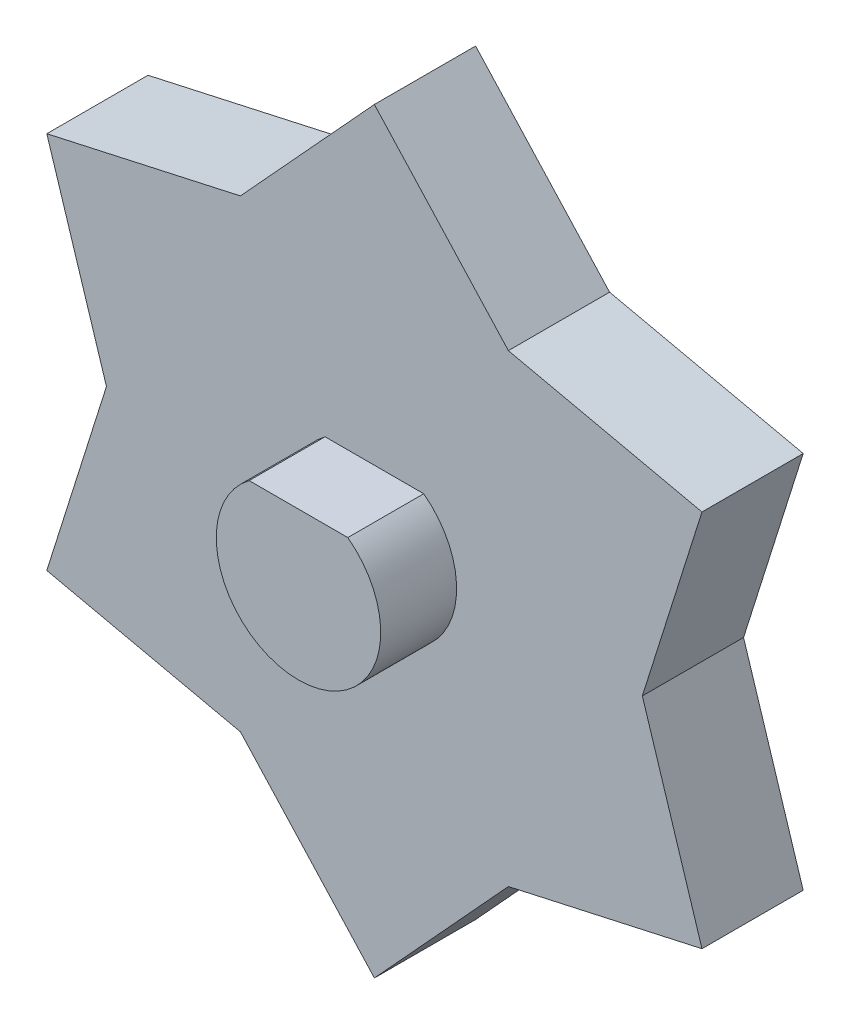
ISO-10303-21;
HEADER;
FILE_DESCRIPTION(('STEP AP214'),'2;1');
FILE_NAME('part.step','',(''),(''),'','','');
FILE_SCHEMA(('AUTOMOTIVE_DESIGN { 1 0 10303 214 1 1 1 1 }'));
ENDSEC;
DATA;
#1=APPLICATION_CONTEXT('core data for automotive mechanical design processes');
#2=APPLICATION_PROTOCOL_DEFINITION('international standard','automotive_design',2000,#1);
#3=PRODUCT_CONTEXT('',#1,'mechanical');
#4=PRODUCT('Part','Part','',(#3));
#5=PRODUCT_RELATED_PRODUCT_CATEGORY('part','',(#4));
#6=PRODUCT_DEFINITION_FORMATION('','',#4);
#7=PRODUCT_DEFINITION_CONTEXT('part definition',#1,'design');
#8=PRODUCT_DEFINITION('design','',#6,#7);
#9=PRODUCT_DEFINITION_SHAPE('','',#8);
#10=(LENGTH_UNIT() NAMED_UNIT(*) SI_UNIT(.MILLI.,.METRE.));
#11=(NAMED_UNIT(*) PLANE_ANGLE_UNIT() SI_UNIT($,.RADIAN.));
#12=(NAMED_UNIT(*) SI_UNIT($,.STERADIAN.) SOLID_ANGLE_UNIT());
#13=UNCERTAINTY_MEASURE_WITH_UNIT(LENGTH_MEASURE(1.E-05),#10,'distance_accuracy_value','');
#14=(GEOMETRIC_REPRESENTATION_CONTEXT(3) GLOBAL_UNCERTAINTY_ASSIGNED_CONTEXT((#13)) GLOBAL_UNIT_ASSIGNED_CONTEXT((#10,
#11,#12)) REPRESENTATION_CONTEXT('',''));
#15=CARTESIAN_POINT('',(0.,0.,0.));
#16=DIRECTION('',(0.,0.,1.));
#17=DIRECTION('',(1.,0.,0.));
#18=AXIS2_PLACEMENT_3D('',#15,#16,#17);
#19=CARTESIAN_POINT('',(0.,0.,0.));
#20=DIRECTION('',(0.,0.,1.));
#21=DIRECTION('',(1.,0.,0.));
#22=AXIS2_PLACEMENT_3D('',#19,#20,#21);
#23=PLANE('',#22);
#24=DIRECTION('',(0.300705799504278,-0.953716950748225,0.));
#25=VECTOR('',#24,1.);
#26=CARTESIAN_POINT('',(4.81627060127854,1.51856428749661,0.));
#27=LINE('',#26,#25);
#28=CARTESIAN_POINT('',(5.29507208196112,0.,0.));
#29=VERTEX_POINT('',#28);
#30=CARTESIAN_POINT('',(6.4734927176438,-3.73747276312873,0.));
#31=VERTEX_POINT('',#30);
#32=EDGE_CURVE('E214',#29,#31,#27,.T.);
#33=ORIENTED_EDGE('',*,*,#32,.F.);
#34=DIRECTION('',(-0.300705799504272,-0.953716950748227,0.));
#35=VECTOR('',#34,1.);
#36=CARTESIAN_POINT('',(4.81627060127858,-1.51856428749658,0.));
#37=LINE('',#36,#35);
#38=CARTESIAN_POINT('',(6.4734927176438,3.73747276312873,0.));
#39=VERTEX_POINT('',#38);
#40=EDGE_CURVE('E217',#39,#29,#37,.T.);
#41=ORIENTED_EDGE('',*,*,#40,.F.);
#42=DIRECTION('',(0.976296007119935,-0.216439613938098,0.));
#43=VECTOR('',#42,1.);
#44=CARTESIAN_POINT('',(1.09302005038739,4.93029483595567,0.));
#45=LINE('',#44,#43);
#46=CARTESIAN_POINT('',(2.6475360409806,4.58566693784806,0.));
#47=VERTEX_POINT('',#46);
#48=EDGE_CURVE('E220',#47,#39,#45,.T.);
#49=ORIENTED_EDGE('',*,*,#48,.F.);
#50=DIRECTION('',(0.675590207615661,-0.737277336810123,0.));
#51=VECTOR('',#50,1.);
#52=CARTESIAN_POINT('',(3.72325055089115,3.41173054845911,0.));
#53=LINE('',#52,#51);
#54=CARTESIAN_POINT('',(0.,7.47494552625746,0.));
#55=VERTEX_POINT('',#54);
#56=EDGE_CURVE('E222',#55,#47,#53,.T.);
#57=ORIENTED_EDGE('',*,*,#56,.F.);
#58=DIRECTION('',(0.675590207615657,0.737277336810128,0.));
#59=VECTOR('',#58,1.);
#60=CARTESIAN_POINT('',(-3.72325055089115,3.41173054845907,0.));
#61=LINE('',#60,#59);
#62=CARTESIAN_POINT('',(-2.64753604098053,4.5856669378481,0.));
#63=VERTEX_POINT('',#62);
#64=EDGE_CURVE('E224',#63,#55,#61,.T.);
#65=ORIENTED_EDGE('',*,*,#64,.F.);
#66=DIRECTION('',(0.976296007119933,0.216439613938105,0.));
#67=VECTOR('',#66,1.);
#68=CARTESIAN_POINT('',(-1.09302005038744,4.9302948359557,0.));
#69=LINE('',#68,#67);
#70=CARTESIAN_POINT('',(-6.4734927176438,3.73747276312873,0.));
#71=VERTEX_POINT('',#70);
#72=EDGE_CURVE('E226',#71,#63,#69,.T.);
#73=ORIENTED_EDGE('',*,*,#72,.F.);
#74=DIRECTION('',(-0.300705799504278,0.953716950748225,0.));
#75=VECTOR('',#74,1.);
#76=CARTESIAN_POINT('',(-4.81627060127854,-1.51856428749661,0.));
#77=LINE('',#76,#75);
#78=CARTESIAN_POINT('',(-5.29507208196112,0.,0.));
#79=VERTEX_POINT('',#78);
#80=EDGE_CURVE('E228',#79,#71,#77,.T.);
#81=ORIENTED_EDGE('',*,*,#80,.F.);
#82=DIRECTION('',(0.300705799504271,0.953716950748228,0.));
#83=VECTOR('',#82,1.);
#84=CARTESIAN_POINT('',(-4.81627060127859,1.51856428749658,0.));
#85=LINE('',#84,#83);
#86=CARTESIAN_POINT('',(-6.4734927176438,-3.73747276312873,0.));
#87=VERTEX_POINT('',#86);
#88=EDGE_CURVE('E230',#87,#79,#85,.T.);
#89=ORIENTED_EDGE('',*,*,#88,.F.);
#90=DIRECTION('',(-0.976296007119935,0.216439613938097,0.));
#91=VECTOR('',#90,1.);
#92=CARTESIAN_POINT('',(-1.09302005038739,-4.93029483595567,0.));
#93=LINE('',#92,#91);
#94=CARTESIAN_POINT('',(-2.6475360409806,-4.58566693784807,0.));
#95=VERTEX_POINT('',#94);
#96=EDGE_CURVE('E232',#95,#87,#93,.T.);
#97=ORIENTED_EDGE('',*,*,#96,.F.);
#98=DIRECTION('',(-0.675590207615661,0.737277336810123,0.));
#99=VECTOR('',#98,1.);
#100=CARTESIAN_POINT('',(-3.72325055089115,-3.41173054845912,0.));
#101=LINE('',#100,#99);
#102=CARTESIAN_POINT('',(0.,-7.47494552625746,0.));
#103=VERTEX_POINT('',#102);
#104=EDGE_CURVE('E234',#103,#95,#101,.T.);
#105=ORIENTED_EDGE('',*,*,#104,.F.);
#106=DIRECTION('',(-0.675590207615656,-0.737277336810128,0.));
#107=VECTOR('',#106,1.);
#108=CARTESIAN_POINT('',(3.72325055089115,-3.41173054845907,0.));
#109=LINE('',#108,#107);
#110=CARTESIAN_POINT('',(2.64753604098052,-4.58566693784811,0.));
#111=VERTEX_POINT('',#110);
#112=EDGE_CURVE('E197',#111,#103,#109,.T.);
#113=ORIENTED_EDGE('',*,*,#112,.F.);
#114=DIRECTION('',(-0.976296007119933,-0.216439613938104,0.));
#115=VECTOR('',#114,1.);
#116=CARTESIAN_POINT('',(1.09302005038744,-4.9302948359557,0.));
#117=LINE('',#116,#115);
#118=EDGE_CURVE('E150',#31,#111,#117,.T.);
#119=ORIENTED_EDGE('',*,*,#118,.F.);
#120=EDGE_LOOP('',(#33,#41,#49,#57,#65,#73,#81,#89,#97,#105,#113,#119));
#121=FACE_BOUND('',#120,.T.);
#122=CARTESIAN_POINT('',(0.,0.,0.));
#123=DIRECTION('',(0.,0.,1.));
#124=DIRECTION('',(1.,0.,0.));
#125=AXIS2_PLACEMENT_3D('',#122,#123,#124);
#126=CIRCLE('',#125,1.625);
#127=CARTESIAN_POINT('',(-0.975,1.3,0.));
#128=VERTEX_POINT('',#127);
#129=CARTESIAN_POINT('',(0.975,1.3,0.));
#130=VERTEX_POINT('',#129);
#131=EDGE_CURVE('E92',#128,#130,#126,.T.);
#132=ORIENTED_EDGE('',*,*,#131,.F.);
#133=DIRECTION('',(1.,0.,0.));
#134=VECTOR('',#133,1.);
#135=CARTESIAN_POINT('',(0.,1.3,0.));
#136=LINE('',#135,#134);
#137=EDGE_CURVE('E12',#128,#130,#136,.T.);
#138=ORIENTED_EDGE('',*,*,#137,.T.);
#139=EDGE_LOOP('',(#132,#138));
#140=FACE_BOUND('',#139,.T.);
#141=ADVANCED_FACE('F84',(#121,#140),#23,.T.);
#142=CARTESIAN_POINT('',(4.81627060127854,1.51856428749661,-2.));
#143=DIRECTION('',(-0.953716950748225,-0.300705799504278,0.));
#144=DIRECTION('',(0.300705799504278,-0.953716950748225,0.));
#145=AXIS2_PLACEMENT_3D('',#142,#143,#144);
#146=PLANE('',#145);
#147=ORIENTED_EDGE('',*,*,#32,.T.);
#148=DIRECTION('',(0.,0.,1.));
#149=VECTOR('',#148,1.);
#150=CARTESIAN_POINT('',(6.4734927176438,-3.73747276312873,-2.));
#151=LINE('',#150,#149);
#152=CARTESIAN_POINT('',(6.4734927176438,-3.73747276312873,-2.));
#153=VERTEX_POINT('',#152);
#154=EDGE_CURVE('E239',#153,#31,#151,.T.);
#155=ORIENTED_EDGE('',*,*,#154,.F.);
#156=DIRECTION('',(0.300705799504278,-0.953716950748225,0.));
#157=VECTOR('',#156,1.);
#158=CARTESIAN_POINT('',(4.81627060127854,1.51856428749661,-2.));
#159=LINE('',#158,#157);
#160=CARTESIAN_POINT('',(5.29507208196112,0.,-2.));
#161=VERTEX_POINT('',#160);
#162=EDGE_CURVE('E238',#161,#153,#159,.T.);
#163=ORIENTED_EDGE('',*,*,#162,.F.);
#164=DIRECTION('',(0.,0.,1.));
#165=VECTOR('',#164,1.);
#166=CARTESIAN_POINT('',(5.29507208196112,0.,-2.));
#167=LINE('',#166,#165);
#168=EDGE_CURVE('E213',#161,#29,#167,.T.);
#169=ORIENTED_EDGE('',*,*,#168,.T.);
#170=EDGE_LOOP('',(#147,#155,#163,#169));
#171=FACE_BOUND('',#170,.T.);
#172=ADVANCED_FACE('F86',(#171),#146,.F.);
#173=CARTESIAN_POINT('',(1.09302005038744,-4.9302948359557,-2.));
#174=DIRECTION('',(-0.216439613938104,0.976296007119933,0.));
#175=DIRECTION('',(-0.976296007119933,-0.216439613938104,0.));
#176=AXIS2_PLACEMENT_3D('',#173,#174,#175);
#177=PLANE('',#176);
#178=ORIENTED_EDGE('',*,*,#118,.T.);
#179=DIRECTION('',(0.,0.,1.));
#180=VECTOR('',#179,1.);
#181=CARTESIAN_POINT('',(2.64753604098052,-4.58566693784811,-2.));
#182=LINE('',#181,#180);
#183=CARTESIAN_POINT('',(2.64753604098052,-4.58566693784811,-2.));
#184=VERTEX_POINT('',#183);
#185=EDGE_CURVE('E200',#184,#111,#182,.T.);
#186=ORIENTED_EDGE('',*,*,#185,.F.);
#187=DIRECTION('',(-0.976296007119933,-0.216439613938104,0.));
#188=VECTOR('',#187,1.);
#189=CARTESIAN_POINT('',(1.09302005038744,-4.9302948359557,-2.));
#190=LINE('',#189,#188);
#191=EDGE_CURVE('E105',#153,#184,#190,.T.);
#192=ORIENTED_EDGE('',*,*,#191,.F.);
#193=ORIENTED_EDGE('',*,*,#154,.T.);
#194=EDGE_LOOP('',(#178,#186,#192,#193));
#195=FACE_BOUND('',#194,.T.);
#196=ADVANCED_FACE('F334',(#195),#177,.F.);
#197=CARTESIAN_POINT('',(3.72325055089115,-3.41173054845907,-2.));
#198=DIRECTION('',(-0.737277336810128,0.675590207615656,0.));
#199=DIRECTION('',(-0.675590207615656,-0.737277336810128,0.));
#200=AXIS2_PLACEMENT_3D('',#197,#198,#199);
#201=PLANE('',#200);
#202=ORIENTED_EDGE('',*,*,#112,.T.);
#203=DIRECTION('',(0.,0.,1.));
#204=VECTOR('',#203,1.);
#205=CARTESIAN_POINT('',(0.,-7.47494552625746,-2.));
#206=LINE('',#205,#204);
#207=CARTESIAN_POINT('',(0.,-7.47494552625746,-2.));
#208=VERTEX_POINT('',#207);
#209=EDGE_CURVE('E195',#208,#103,#206,.T.);
#210=ORIENTED_EDGE('',*,*,#209,.F.);
#211=DIRECTION('',(-0.675590207615656,-0.737277336810128,0.));
#212=VECTOR('',#211,1.);
#213=CARTESIAN_POINT('',(3.72325055089115,-3.41173054845907,-2.));
#214=LINE('',#213,#212);
#215=EDGE_CURVE('E185',#184,#208,#214,.T.);
#216=ORIENTED_EDGE('',*,*,#215,.F.);
#217=ORIENTED_EDGE('',*,*,#185,.T.);
#218=EDGE_LOOP('',(#202,#210,#216,#217));
#219=FACE_BOUND('',#218,.T.);
#220=ADVANCED_FACE('F196',(#219),#201,.F.);
#221=CARTESIAN_POINT('',(-3.72325055089115,-3.41173054845912,-2.));
#222=DIRECTION('',(0.737277336810123,0.675590207615661,0.));
#223=DIRECTION('',(-0.675590207615661,0.737277336810123,0.));
#224=AXIS2_PLACEMENT_3D('',#221,#222,#223);
#225=PLANE('',#224);
#226=ORIENTED_EDGE('',*,*,#104,.T.);
#227=DIRECTION('',(0.,0.,1.));
#228=VECTOR('',#227,1.);
#229=CARTESIAN_POINT('',(-2.6475360409806,-4.58566693784807,-2.));
#230=LINE('',#229,#228);
#231=CARTESIAN_POINT('',(-2.6475360409806,-4.58566693784807,-2.));
#232=VERTEX_POINT('',#231);
#233=EDGE_CURVE('E201',#232,#95,#230,.T.);
#234=ORIENTED_EDGE('',*,*,#233,.F.);
#235=DIRECTION('',(-0.675590207615661,0.737277336810123,0.));
#236=VECTOR('',#235,1.);
#237=CARTESIAN_POINT('',(-3.72325055089115,-3.41173054845912,-2.));
#238=LINE('',#237,#236);
#239=EDGE_CURVE('E189',#208,#232,#238,.T.);
#240=ORIENTED_EDGE('',*,*,#239,.F.);
#241=ORIENTED_EDGE('',*,*,#209,.T.);
#242=EDGE_LOOP('',(#226,#234,#240,#241));
#243=FACE_BOUND('',#242,.T.);
#244=ADVANCED_FACE('F203',(#243),#225,.F.);
#245=CARTESIAN_POINT('',(-1.09302005038739,-4.93029483595567,-2.));
#246=DIRECTION('',(0.216439613938097,0.976296007119935,0.));
#247=DIRECTION('',(-0.976296007119935,0.216439613938097,0.));
#248=AXIS2_PLACEMENT_3D('',#245,#246,#247);
#249=PLANE('',#248);
#250=ORIENTED_EDGE('',*,*,#96,.T.);
#251=DIRECTION('',(0.,0.,1.));
#252=VECTOR('',#251,1.);
#253=CARTESIAN_POINT('',(-6.4734927176438,-3.73747276312873,-2.));
#254=LINE('',#253,#252);
#255=CARTESIAN_POINT('',(-6.4734927176438,-3.73747276312873,-2.));
#256=VERTEX_POINT('',#255);
#257=EDGE_CURVE('E243',#256,#87,#254,.T.);
#258=ORIENTED_EDGE('',*,*,#257,.F.);
#259=DIRECTION('',(-0.976296007119935,0.216439613938097,0.));
#260=VECTOR('',#259,1.);
#261=CARTESIAN_POINT('',(-1.09302005038739,-4.93029483595567,-2.));
#262=LINE('',#261,#260);
#263=EDGE_CURVE('E206',#232,#256,#262,.T.);
#264=ORIENTED_EDGE('',*,*,#263,.F.);
#265=ORIENTED_EDGE('',*,*,#233,.T.);
#266=EDGE_LOOP('',(#250,#258,#264,#265));
#267=FACE_BOUND('',#266,.T.);
#268=ADVANCED_FACE('F337',(#267),#249,.F.);
#269=CARTESIAN_POINT('',(-4.81627060127859,1.51856428749658,-2.));
#270=DIRECTION('',(0.953716950748227,-0.300705799504271,0.));
#271=DIRECTION('',(0.300705799504271,0.953716950748228,0.));
#272=AXIS2_PLACEMENT_3D('',#269,#270,#271);
#273=PLANE('',#272);
#274=ORIENTED_EDGE('',*,*,#88,.T.);
#275=DIRECTION('',(0.,0.,1.));
#276=VECTOR('',#275,1.);
#277=CARTESIAN_POINT('',(-5.29507208196112,0.,-2.));
#278=LINE('',#277,#276);
#279=CARTESIAN_POINT('',(-5.29507208196112,0.,-2.));
#280=VERTEX_POINT('',#279);
#281=EDGE_CURVE('E246',#280,#79,#278,.T.);
#282=ORIENTED_EDGE('',*,*,#281,.F.);
#283=DIRECTION('',(0.300705799504271,0.953716950748228,0.));
#284=VECTOR('',#283,1.);
#285=CARTESIAN_POINT('',(-4.81627060127859,1.51856428749658,-2.));
#286=LINE('',#285,#284);
#287=EDGE_CURVE('E208',#256,#280,#286,.T.);
#288=ORIENTED_EDGE('',*,*,#287,.F.);
#289=ORIENTED_EDGE('',*,*,#257,.T.);
#290=EDGE_LOOP('',(#274,#282,#288,#289));
#291=FACE_BOUND('',#290,.T.);
#292=ADVANCED_FACE('F303',(#291),#273,.F.);
#293=CARTESIAN_POINT('',(-4.81627060127854,-1.51856428749661,-2.));
#294=DIRECTION('',(0.953716950748225,0.300705799504278,0.));
#295=DIRECTION('',(-0.300705799504278,0.953716950748225,0.));
#296=AXIS2_PLACEMENT_3D('',#293,#294,#295);
#297=PLANE('',#296);
#298=ORIENTED_EDGE('',*,*,#80,.T.);
#299=DIRECTION('',(0.,0.,1.));
#300=VECTOR('',#299,1.);
#301=CARTESIAN_POINT('',(-6.4734927176438,3.73747276312873,-2.));
#302=LINE('',#301,#300);
#303=CARTESIAN_POINT('',(-6.4734927176438,3.73747276312873,-2.));
#304=VERTEX_POINT('',#303);
#305=EDGE_CURVE('E249',#304,#71,#302,.T.);
#306=ORIENTED_EDGE('',*,*,#305,.F.);
#307=DIRECTION('',(-0.300705799504278,0.953716950748225,0.));
#308=VECTOR('',#307,1.);
#309=CARTESIAN_POINT('',(-4.81627060127854,-1.51856428749661,-2.));
#310=LINE('',#309,#308);
#311=EDGE_CURVE('E296',#280,#304,#310,.T.);
#312=ORIENTED_EDGE('',*,*,#311,.F.);
#313=ORIENTED_EDGE('',*,*,#281,.T.);
#314=EDGE_LOOP('',(#298,#306,#312,#313));
#315=FACE_BOUND('',#314,.T.);
#316=ADVANCED_FACE('F307',(#315),#297,.F.);
#317=CARTESIAN_POINT('',(-1.09302005038744,4.9302948359557,-2.));
#318=DIRECTION('',(0.216439613938105,-0.976296007119933,0.));
#319=DIRECTION('',(0.976296007119933,0.216439613938105,0.));
#320=AXIS2_PLACEMENT_3D('',#317,#318,#319);
#321=PLANE('',#320);
#322=ORIENTED_EDGE('',*,*,#72,.T.);
#323=DIRECTION('',(0.,0.,1.));
#324=VECTOR('',#323,1.);
#325=CARTESIAN_POINT('',(-2.64753604098053,4.5856669378481,-2.));
#326=LINE('',#325,#324);
#327=CARTESIAN_POINT('',(-2.64753604098053,4.5856669378481,-2.));
#328=VERTEX_POINT('',#327);
#329=EDGE_CURVE('E252',#328,#63,#326,.T.);
#330=ORIENTED_EDGE('',*,*,#329,.F.);
#331=DIRECTION('',(0.976296007119933,0.216439613938105,0.));
#332=VECTOR('',#331,1.);
#333=CARTESIAN_POINT('',(-1.09302005038744,4.9302948359557,-2.));
#334=LINE('',#333,#332);
#335=EDGE_CURVE('E294',#304,#328,#334,.T.);
#336=ORIENTED_EDGE('',*,*,#335,.F.);
#337=ORIENTED_EDGE('',*,*,#305,.T.);
#338=EDGE_LOOP('',(#322,#330,#336,#337));
#339=FACE_BOUND('',#338,.T.);
#340=ADVANCED_FACE('F312',(#339),#321,.F.);
#341=CARTESIAN_POINT('',(-3.72325055089115,3.41173054845907,-2.));
#342=DIRECTION('',(0.737277336810128,-0.675590207615657,0.));
#343=DIRECTION('',(0.675590207615657,0.737277336810128,0.));
#344=AXIS2_PLACEMENT_3D('',#341,#342,#343);
#345=PLANE('',#344);
#346=ORIENTED_EDGE('',*,*,#64,.T.);
#347=DIRECTION('',(0.,0.,1.));
#348=VECTOR('',#347,1.);
#349=CARTESIAN_POINT('',(0.,7.47494552625746,-2.));
#350=LINE('',#349,#348);
#351=CARTESIAN_POINT('',(0.,7.47494552625746,-2.));
#352=VERTEX_POINT('',#351);
#353=EDGE_CURVE('E255',#352,#55,#350,.T.);
#354=ORIENTED_EDGE('',*,*,#353,.F.);
#355=DIRECTION('',(0.675590207615657,0.737277336810128,0.));
#356=VECTOR('',#355,1.);
#357=CARTESIAN_POINT('',(-3.72325055089115,3.41173054845907,-2.));
#358=LINE('',#357,#356);
#359=EDGE_CURVE('E292',#328,#352,#358,.T.);
#360=ORIENTED_EDGE('',*,*,#359,.F.);
#361=ORIENTED_EDGE('',*,*,#329,.T.);
#362=EDGE_LOOP('',(#346,#354,#360,#361));
#363=FACE_BOUND('',#362,.T.);
#364=ADVANCED_FACE('F318',(#363),#345,.F.);
#365=CARTESIAN_POINT('',(3.72325055089115,3.41173054845911,-2.));
#366=DIRECTION('',(-0.737277336810123,-0.675590207615661,0.));
#367=DIRECTION('',(0.675590207615661,-0.737277336810123,0.));
#368=AXIS2_PLACEMENT_3D('',#365,#366,#367);
#369=PLANE('',#368);
#370=ORIENTED_EDGE('',*,*,#56,.T.);
#371=DIRECTION('',(0.,0.,1.));
#372=VECTOR('',#371,1.);
#373=CARTESIAN_POINT('',(2.6475360409806,4.58566693784806,-2.));
#374=LINE('',#373,#372);
#375=CARTESIAN_POINT('',(2.6475360409806,4.58566693784806,-2.));
#376=VERTEX_POINT('',#375);
#377=EDGE_CURVE('E258',#376,#47,#374,.T.);
#378=ORIENTED_EDGE('',*,*,#377,.F.);
#379=DIRECTION('',(0.675590207615661,-0.737277336810123,0.));
#380=VECTOR('',#379,1.);
#381=CARTESIAN_POINT('',(3.72325055089115,3.41173054845911,-2.));
#382=LINE('',#381,#380);
#383=EDGE_CURVE('E290',#352,#376,#382,.T.);
#384=ORIENTED_EDGE('',*,*,#383,.F.);
#385=ORIENTED_EDGE('',*,*,#353,.T.);
#386=EDGE_LOOP('',(#370,#378,#384,#385));
#387=FACE_BOUND('',#386,.T.);
#388=ADVANCED_FACE('F322',(#387),#369,.F.);
#389=CARTESIAN_POINT('',(1.09302005038739,4.93029483595567,-2.));
#390=DIRECTION('',(-0.216439613938098,-0.976296007119935,0.));
#391=DIRECTION('',(0.976296007119935,-0.216439613938098,0.));
#392=AXIS2_PLACEMENT_3D('',#389,#390,#391);
#393=PLANE('',#392);
#394=ORIENTED_EDGE('',*,*,#48,.T.);
#395=DIRECTION('',(0.,0.,1.));
#396=VECTOR('',#395,1.);
#397=CARTESIAN_POINT('',(6.4734927176438,3.73747276312873,-2.));
#398=LINE('',#397,#396);
#399=CARTESIAN_POINT('',(6.4734927176438,3.73747276312873,-2.));
#400=VERTEX_POINT('',#399);
#401=EDGE_CURVE('E261',#400,#39,#398,.T.);
#402=ORIENTED_EDGE('',*,*,#401,.F.);
#403=DIRECTION('',(0.976296007119935,-0.216439613938098,0.));
#404=VECTOR('',#403,1.);
#405=CARTESIAN_POINT('',(1.09302005038739,4.93029483595567,-2.));
#406=LINE('',#405,#404);
#407=EDGE_CURVE('E288',#376,#400,#406,.T.);
#408=ORIENTED_EDGE('',*,*,#407,.F.);
#409=ORIENTED_EDGE('',*,*,#377,.T.);
#410=EDGE_LOOP('',(#394,#402,#408,#409));
#411=FACE_BOUND('',#410,.T.);
#412=ADVANCED_FACE('F327',(#411),#393,.F.);
#413=CARTESIAN_POINT('',(4.81627060127858,-1.51856428749658,-2.));
#414=DIRECTION('',(-0.953716950748227,0.300705799504272,0.));
#415=DIRECTION('',(-0.300705799504272,-0.953716950748227,0.));
#416=AXIS2_PLACEMENT_3D('',#413,#414,#415);
#417=PLANE('',#416);
#418=ORIENTED_EDGE('',*,*,#40,.T.);
#419=ORIENTED_EDGE('',*,*,#168,.F.);
#420=DIRECTION('',(-0.300705799504272,-0.953716950748227,0.));
#421=VECTOR('',#420,1.);
#422=CARTESIAN_POINT('',(4.81627060127858,-1.51856428749658,-2.));
#423=LINE('',#422,#421);
#424=EDGE_CURVE('E157',#400,#161,#423,.T.);
#425=ORIENTED_EDGE('',*,*,#424,.F.);
#426=ORIENTED_EDGE('',*,*,#401,.T.);
#427=EDGE_LOOP('',(#418,#419,#425,#426));
#428=FACE_BOUND('',#427,.T.);
#429=ADVANCED_FACE('F330',(#428),#417,.F.);
#430=CARTESIAN_POINT('',(0.,0.,-2.));
#431=DIRECTION('',(0.,0.,1.));
#432=DIRECTION('',(1.,0.,0.));
#433=AXIS2_PLACEMENT_3D('',#430,#431,#432);
#434=PLANE('',#433);
#435=ORIENTED_EDGE('',*,*,#162,.T.);
#436=ORIENTED_EDGE('',*,*,#191,.T.);
#437=ORIENTED_EDGE('',*,*,#215,.T.);
#438=ORIENTED_EDGE('',*,*,#239,.T.);
#439=ORIENTED_EDGE('',*,*,#263,.T.);
#440=ORIENTED_EDGE('',*,*,#287,.T.);
#441=ORIENTED_EDGE('',*,*,#311,.T.);
#442=ORIENTED_EDGE('',*,*,#335,.T.);
#443=ORIENTED_EDGE('',*,*,#359,.T.);
#444=ORIENTED_EDGE('',*,*,#383,.T.);
#445=ORIENTED_EDGE('',*,*,#407,.T.);
#446=ORIENTED_EDGE('',*,*,#424,.T.);
#447=EDGE_LOOP('',(#435,#436,#437,#438,#439,#440,#441,#442,#443,#444,#445,#446));
#448=FACE_BOUND('',#447,.T.);
#449=ADVANCED_FACE('F187',(#448),#434,.F.);
#450=CARTESIAN_POINT('',(0.,1.3,-6.37242781529896));
#451=DIRECTION('',(0.,-1.,0.));
#452=DIRECTION('',(0.,0.,-1.));
#453=AXIS2_PLACEMENT_3D('',#450,#451,#452);
#454=PLANE('',#453);
#455=ORIENTED_EDGE('',*,*,#137,.F.);
#456=DIRECTION('',(0.,0.,1.));
#457=VECTOR('',#456,1.);
#458=CARTESIAN_POINT('',(-0.975,1.3,-6.37242781529896));
#459=LINE('',#458,#457);
#460=CARTESIAN_POINT('',(-0.975,1.3,1.5));
#461=VERTEX_POINT('',#460);
#462=EDGE_CURVE('E274',#128,#461,#459,.T.);
#463=ORIENTED_EDGE('',*,*,#462,.T.);
#464=DIRECTION('',(1.,0.,0.));
#465=VECTOR('',#464,1.);
#466=CARTESIAN_POINT('',(0.,1.3,1.5));
#467=LINE('',#466,#465);
#468=CARTESIAN_POINT('',(0.975,1.3,1.5));
#469=VERTEX_POINT('',#468);
#470=EDGE_CURVE('E279',#461,#469,#467,.T.);
#471=ORIENTED_EDGE('',*,*,#470,.T.);
#472=DIRECTION('',(0.,0.,1.));
#473=VECTOR('',#472,1.);
#474=CARTESIAN_POINT('',(0.975,1.3,-6.37242781529896));
#475=LINE('',#474,#473);
#476=EDGE_CURVE('E218',#130,#469,#475,.T.);
#477=ORIENTED_EDGE('',*,*,#476,.F.);
#478=EDGE_LOOP('',(#455,#463,#471,#477));
#479=FACE_BOUND('',#478,.T.);
#480=ADVANCED_FACE('F277',(#479),#454,.F.);
#481=CARTESIAN_POINT('',(0.,0.,-6.37242781529896));
#482=DIRECTION('',(0.,0.,1.));
#483=DIRECTION('',(1.,0.,0.));
#484=AXIS2_PLACEMENT_3D('',#481,#482,#483);
#485=CYLINDRICAL_SURFACE('',#484,1.625);
#486=ORIENTED_EDGE('',*,*,#462,.F.);
#487=ORIENTED_EDGE('',*,*,#131,.T.);
#488=ORIENTED_EDGE('',*,*,#476,.T.);
#489=CARTESIAN_POINT('',(0.,0.,1.5));
#490=DIRECTION('',(0.,0.,1.));
#491=DIRECTION('',(1.,0.,0.));
#492=AXIS2_PLACEMENT_3D('',#489,#490,#491);
#493=CIRCLE('',#492,1.625);
#494=EDGE_CURVE('E281',#461,#469,#493,.T.);
#495=ORIENTED_EDGE('',*,*,#494,.F.);
#496=EDGE_LOOP('',(#486,#487,#488,#495));
#497=FACE_BOUND('',#496,.T.);
#498=ADVANCED_FACE('F269',(#497),#485,.T.);
#499=CARTESIAN_POINT('',(0.,0.,1.5));
#500=DIRECTION('',(0.,0.,1.));
#501=DIRECTION('',(1.,0.,0.));
#502=AXIS2_PLACEMENT_3D('',#499,#500,#501);
#503=PLANE('',#502);
#504=ORIENTED_EDGE('',*,*,#470,.F.);
#505=ORIENTED_EDGE('',*,*,#494,.T.);
#506=EDGE_LOOP('',(#504,#505));
#507=FACE_BOUND('',#506,.T.);
#508=ADVANCED_FACE('F499',(#507),#503,.T.);
#509=CLOSED_SHELL('',(#141,#172,#196,#220,#244,#268,#292,#316,#340,#364,#388,#412,#429,#449,
#480,#498,#508));
#510=MANIFOLD_SOLID_BREP('B2',#509);
#511=ADVANCED_BREP_SHAPE_REPRESENTATION('',(#18,#510),#14);
#512=SHAPE_DEFINITION_REPRESENTATION(#9,#511);
ENDSEC;
END-ISO-10303-21;
